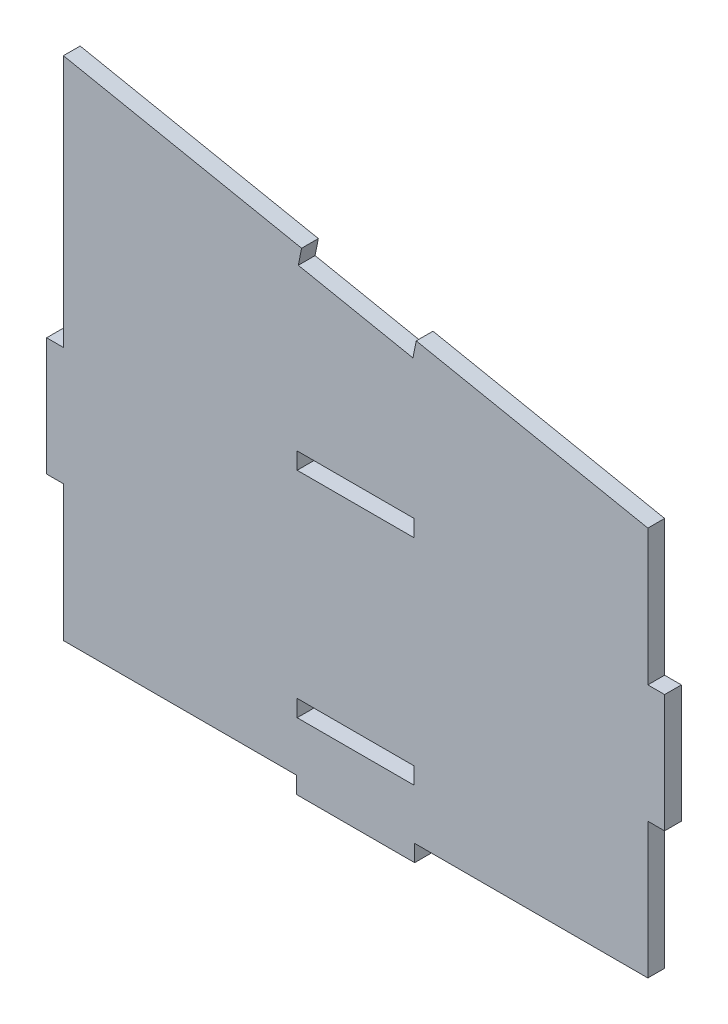
ISO-10303-21;
HEADER;
FILE_DESCRIPTION(('STEP AP214'),'2;1');
FILE_NAME('part.step','',(''),(''),'','','');
FILE_SCHEMA(('AUTOMOTIVE_DESIGN { 1 0 10303 214 1 1 1 1 }'));
ENDSEC;
DATA;
#1=APPLICATION_CONTEXT('core data for automotive mechanical design processes');
#2=APPLICATION_PROTOCOL_DEFINITION('international standard','automotive_design',2000,#1);
#3=PRODUCT_CONTEXT('',#1,'mechanical');
#4=PRODUCT('Part','Part','',(#3));
#5=PRODUCT_RELATED_PRODUCT_CATEGORY('part','',(#4));
#6=PRODUCT_DEFINITION_FORMATION('','',#4);
#7=PRODUCT_DEFINITION_CONTEXT('part definition',#1,'design');
#8=PRODUCT_DEFINITION('design','',#6,#7);
#9=PRODUCT_DEFINITION_SHAPE('','',#8);
#10=(LENGTH_UNIT() NAMED_UNIT(*) SI_UNIT(.MILLI.,.METRE.));
#11=(NAMED_UNIT(*) PLANE_ANGLE_UNIT() SI_UNIT($,.RADIAN.));
#12=(NAMED_UNIT(*) SI_UNIT($,.STERADIAN.) SOLID_ANGLE_UNIT());
#13=UNCERTAINTY_MEASURE_WITH_UNIT(LENGTH_MEASURE(1.E-05),#10,'distance_accuracy_value','');
#14=(GEOMETRIC_REPRESENTATION_CONTEXT(3) GLOBAL_UNCERTAINTY_ASSIGNED_CONTEXT((#13)) GLOBAL_UNIT_ASSIGNED_CONTEXT((#10,
#11,#12)) REPRESENTATION_CONTEXT('',''));
#15=CARTESIAN_POINT('',(0.,0.,0.));
#16=DIRECTION('',(0.,0.,1.));
#17=DIRECTION('',(1.,0.,0.));
#18=AXIS2_PLACEMENT_3D('',#15,#16,#17);
#19=CARTESIAN_POINT('',(0.,0.,4.3));
#20=DIRECTION('',(0.,0.,1.));
#21=DIRECTION('',(1.,0.,0.));
#22=AXIS2_PLACEMENT_3D('',#19,#20,#21);
#23=PLANE('',#22);
#24=DIRECTION('',(-0.98058067569092,0.196116135138184,0.));
#25=VECTOR('',#24,1.);
#26=CARTESIAN_POINT('',(61.1345892457303,117.773082150854,4.3));
#27=LINE('',#26,#25);
#28=CARTESIAN_POINT('',(61.1345892457303,117.773082150854,4.3));
#29=VERTEX_POINT('',#28);
#30=CARTESIAN_POINT('',(0.,130.,4.3));
#31=VERTEX_POINT('',#30);
#32=EDGE_CURVE('E288',#29,#31,#27,.T.);
#33=ORIENTED_EDGE('',*,*,#32,.T.);
#34=DIRECTION('',(0.,-1.,0.));
#35=VECTOR('',#34,1.);
#36=CARTESIAN_POINT('',(0.,130.,4.3));
#37=LINE('',#36,#35);
#38=CARTESIAN_POINT('',(0.,65.15,4.3));
#39=VERTEX_POINT('',#38);
#40=EDGE_CURVE('E291',#31,#39,#37,.T.);
#41=ORIENTED_EDGE('',*,*,#40,.T.);
#42=DIRECTION('',(-1.,0.,0.));
#43=VECTOR('',#42,1.);
#44=CARTESIAN_POINT('',(0.,65.15,4.3));
#45=LINE('',#44,#43);
#46=CARTESIAN_POINT('',(-4.3,65.15,4.3));
#47=VERTEX_POINT('',#46);
#48=EDGE_CURVE('E294',#39,#47,#45,.T.);
#49=ORIENTED_EDGE('',*,*,#48,.T.);
#50=DIRECTION('',(0.,-1.,0.));
#51=VECTOR('',#50,1.);
#52=CARTESIAN_POINT('',(-4.3,65.15,4.3));
#53=LINE('',#52,#51);
#54=CARTESIAN_POINT('',(-4.3,34.85,4.3));
#55=VERTEX_POINT('',#54);
#56=EDGE_CURVE('E296',#47,#55,#53,.T.);
#57=ORIENTED_EDGE('',*,*,#56,.T.);
#58=DIRECTION('',(1.,0.,0.));
#59=VECTOR('',#58,1.);
#60=CARTESIAN_POINT('',(0.,34.85,4.3));
#61=LINE('',#60,#59);
#62=CARTESIAN_POINT('',(0.,34.85,4.3));
#63=VERTEX_POINT('',#62);
#64=EDGE_CURVE('E298',#55,#63,#61,.T.);
#65=ORIENTED_EDGE('',*,*,#64,.T.);
#66=DIRECTION('',(0.,-1.,0.));
#67=VECTOR('',#66,1.);
#68=CARTESIAN_POINT('',(0.,34.85,4.3));
#69=LINE('',#68,#67);
#70=CARTESIAN_POINT('',(0.,0.,4.3));
#71=VERTEX_POINT('',#70);
#72=EDGE_CURVE('E300',#63,#71,#69,.T.);
#73=ORIENTED_EDGE('',*,*,#72,.T.);
#74=DIRECTION('',(1.,0.,0.));
#75=VECTOR('',#74,1.);
#76=CARTESIAN_POINT('',(0.,0.,4.3));
#77=LINE('',#76,#75);
#78=CARTESIAN_POINT('',(59.85,0.,4.3));
#79=VERTEX_POINT('',#78);
#80=EDGE_CURVE('E302',#71,#79,#77,.T.);
#81=ORIENTED_EDGE('',*,*,#80,.T.);
#82=DIRECTION('',(0.,-1.,0.));
#83=VECTOR('',#82,1.);
#84=CARTESIAN_POINT('',(59.85,0.,4.3));
#85=LINE('',#84,#83);
#86=CARTESIAN_POINT('',(59.85,-4.3,4.3));
#87=VERTEX_POINT('',#86);
#88=EDGE_CURVE('E304',#79,#87,#85,.T.);
#89=ORIENTED_EDGE('',*,*,#88,.T.);
#90=DIRECTION('',(1.,0.,0.));
#91=VECTOR('',#90,1.);
#92=CARTESIAN_POINT('',(90.15,-4.3,4.3));
#93=LINE('',#92,#91);
#94=CARTESIAN_POINT('',(90.15,-4.3,4.3));
#95=VERTEX_POINT('',#94);
#96=EDGE_CURVE('E306',#87,#95,#93,.T.);
#97=ORIENTED_EDGE('',*,*,#96,.T.);
#98=DIRECTION('',(0.,1.,0.));
#99=VECTOR('',#98,1.);
#100=CARTESIAN_POINT('',(90.15,0.,4.3));
#101=LINE('',#100,#99);
#102=CARTESIAN_POINT('',(90.15,0.,4.3));
#103=VERTEX_POINT('',#102);
#104=EDGE_CURVE('E308',#95,#103,#101,.T.);
#105=ORIENTED_EDGE('',*,*,#104,.T.);
#106=DIRECTION('',(1.,0.,0.));
#107=VECTOR('',#106,1.);
#108=CARTESIAN_POINT('',(90.15,0.,4.3));
#109=LINE('',#108,#107);
#110=CARTESIAN_POINT('',(150.,0.,4.3));
#111=VERTEX_POINT('',#110);
#112=EDGE_CURVE('E310',#103,#111,#109,.T.);
#113=ORIENTED_EDGE('',*,*,#112,.T.);
#114=DIRECTION('',(0.,1.,0.));
#115=VECTOR('',#114,1.);
#116=CARTESIAN_POINT('',(150.,0.,4.3));
#117=LINE('',#116,#115);
#118=CARTESIAN_POINT('',(150.,34.85,4.3));
#119=VERTEX_POINT('',#118);
#120=EDGE_CURVE('E312',#111,#119,#117,.T.);
#121=ORIENTED_EDGE('',*,*,#120,.T.);
#122=DIRECTION('',(1.,0.,0.));
#123=VECTOR('',#122,1.);
#124=CARTESIAN_POINT('',(150.,34.85,4.3));
#125=LINE('',#124,#123);
#126=CARTESIAN_POINT('',(154.3,34.85,4.3));
#127=VERTEX_POINT('',#126);
#128=EDGE_CURVE('E314',#119,#127,#125,.T.);
#129=ORIENTED_EDGE('',*,*,#128,.T.);
#130=DIRECTION('',(0.,1.,0.));
#131=VECTOR('',#130,1.);
#132=CARTESIAN_POINT('',(154.3,65.15,4.3));
#133=LINE('',#132,#131);
#134=CARTESIAN_POINT('',(154.3,65.15,4.3));
#135=VERTEX_POINT('',#134);
#136=EDGE_CURVE('E316',#127,#135,#133,.T.);
#137=ORIENTED_EDGE('',*,*,#136,.T.);
#138=DIRECTION('',(-1.,0.,0.));
#139=VECTOR('',#138,1.);
#140=CARTESIAN_POINT('',(150.,65.15,4.3));
#141=LINE('',#140,#139);
#142=CARTESIAN_POINT('',(150.,65.15,4.3));
#143=VERTEX_POINT('',#142);
#144=EDGE_CURVE('E318',#135,#143,#141,.T.);
#145=ORIENTED_EDGE('',*,*,#144,.T.);
#146=DIRECTION('',(0.,1.,0.));
#147=VECTOR('',#146,1.);
#148=CARTESIAN_POINT('',(150.,65.15,4.3));
#149=LINE('',#148,#147);
#150=CARTESIAN_POINT('',(150.,100.,4.3));
#151=VERTEX_POINT('',#150);
#152=EDGE_CURVE('E320',#143,#151,#149,.T.);
#153=ORIENTED_EDGE('',*,*,#152,.T.);
#154=DIRECTION('',(-0.98058067569092,0.196116135138184,0.));
#155=VECTOR('',#154,1.);
#156=CARTESIAN_POINT('',(150.,100.,4.3));
#157=LINE('',#156,#155);
#158=CARTESIAN_POINT('',(90.5520095164579,111.889598096708,4.3));
#159=VERTEX_POINT('',#158);
#160=EDGE_CURVE('E322',#151,#159,#157,.T.);
#161=ORIENTED_EDGE('',*,*,#160,.T.);
#162=DIRECTION('',(-0.196116135138183,-0.98058067569092,0.));
#163=VECTOR('',#162,1.);
#164=CARTESIAN_POINT('',(90.5520095164579,111.889598096708,4.3));
#165=LINE('',#164,#163);
#166=CARTESIAN_POINT('',(89.7087101353637,107.673101191237,4.3));
#167=VERTEX_POINT('',#166);
#168=EDGE_CURVE('E324',#159,#167,#165,.T.);
#169=ORIENTED_EDGE('',*,*,#168,.T.);
#170=DIRECTION('',(-0.98058067569092,0.196116135138184,0.));
#171=VECTOR('',#170,1.);
#172=CARTESIAN_POINT('',(89.7087101353637,107.673101191237,4.3));
#173=LINE('',#172,#171);
#174=CARTESIAN_POINT('',(60.2912898646361,113.556585245383,4.3));
#175=VERTEX_POINT('',#174);
#176=EDGE_CURVE('E326',#167,#175,#173,.T.);
#177=ORIENTED_EDGE('',*,*,#176,.T.);
#178=DIRECTION('',(0.196116135138188,0.980580675690919,0.));
#179=VECTOR('',#178,1.);
#180=CARTESIAN_POINT('',(61.1345892457303,117.773082150854,4.3));
#181=LINE('',#180,#179);
#182=EDGE_CURVE('E328',#175,#29,#181,.T.);
#183=ORIENTED_EDGE('',*,*,#182,.T.);
#184=EDGE_LOOP('',(#33,#41,#49,#57,#65,#73,#81,#89,#97,#105,#113,#121,#129,#137,#145,#153,#161,
#169,#177,#183));
#185=FACE_BOUND('',#184,.T.);
#186=DIRECTION('',(-1.,0.,0.));
#187=VECTOR('',#186,1.);
#188=CARTESIAN_POINT('',(60.,17.15,4.3));
#189=LINE('',#188,#187);
#190=CARTESIAN_POINT('',(90.,17.15,4.3));
#191=VERTEX_POINT('',#190);
#192=CARTESIAN_POINT('',(60.,17.15,4.3));
#193=VERTEX_POINT('',#192);
#194=EDGE_CURVE('E259',#191,#193,#189,.T.);
#195=ORIENTED_EDGE('',*,*,#194,.F.);
#196=DIRECTION('',(0.,1.,0.));
#197=VECTOR('',#196,1.);
#198=CARTESIAN_POINT('',(90.,17.15,4.3));
#199=LINE('',#198,#197);
#200=CARTESIAN_POINT('',(90.,12.85,4.3));
#201=VERTEX_POINT('',#200);
#202=EDGE_CURVE('E257',#201,#191,#199,.T.);
#203=ORIENTED_EDGE('',*,*,#202,.F.);
#204=DIRECTION('',(1.,0.,0.));
#205=VECTOR('',#204,1.);
#206=CARTESIAN_POINT('',(60.,12.85,4.3));
#207=LINE('',#206,#205);
#208=CARTESIAN_POINT('',(60.,12.85,4.3));
#209=VERTEX_POINT('',#208);
#210=EDGE_CURVE('E265',#209,#201,#207,.T.);
#211=ORIENTED_EDGE('',*,*,#210,.F.);
#212=DIRECTION('',(0.,-1.,0.));
#213=VECTOR('',#212,1.);
#214=CARTESIAN_POINT('',(60.,17.15,4.3));
#215=LINE('',#214,#213);
#216=EDGE_CURVE('E262',#193,#209,#215,.T.);
#217=ORIENTED_EDGE('',*,*,#216,.F.);
#218=EDGE_LOOP('',(#195,#203,#211,#217));
#219=FACE_BOUND('',#218,.T.);
#220=DIRECTION('',(-1.,0.,0.));
#221=VECTOR('',#220,1.);
#222=CARTESIAN_POINT('',(59.9999999999999,72.15,4.3));
#223=LINE('',#222,#221);
#224=CARTESIAN_POINT('',(89.9999999999999,72.15,4.3));
#225=VERTEX_POINT('',#224);
#226=CARTESIAN_POINT('',(59.9999999999999,72.15,4.3));
#227=VERTEX_POINT('',#226);
#228=EDGE_CURVE('E229',#225,#227,#223,.T.);
#229=ORIENTED_EDGE('',*,*,#228,.F.);
#230=DIRECTION('',(0.,1.,0.));
#231=VECTOR('',#230,1.);
#232=CARTESIAN_POINT('',(89.9999999999999,72.15,4.3));
#233=LINE('',#232,#231);
#234=CARTESIAN_POINT('',(89.9999999999999,67.85,4.3));
#235=VERTEX_POINT('',#234);
#236=EDGE_CURVE('E221',#235,#225,#233,.T.);
#237=ORIENTED_EDGE('',*,*,#236,.F.);
#238=DIRECTION('',(1.,0.,0.));
#239=VECTOR('',#238,1.);
#240=CARTESIAN_POINT('',(59.9999999999999,67.85,4.3));
#241=LINE('',#240,#239);
#242=CARTESIAN_POINT('',(59.9999999999999,67.85,4.3));
#243=VERTEX_POINT('',#242);
#244=EDGE_CURVE('E243',#243,#235,#241,.T.);
#245=ORIENTED_EDGE('',*,*,#244,.F.);
#246=DIRECTION('',(0.,-1.,0.));
#247=VECTOR('',#246,1.);
#248=CARTESIAN_POINT('',(59.9999999999999,72.15,4.3));
#249=LINE('',#248,#247);
#250=EDGE_CURVE('E241',#227,#243,#249,.T.);
#251=ORIENTED_EDGE('',*,*,#250,.F.);
#252=EDGE_LOOP('',(#229,#237,#245,#251));
#253=FACE_BOUND('',#252,.T.);
#254=ADVANCED_FACE('F36',(#185,#219,#253),#23,.T.);
#255=CARTESIAN_POINT('',(0.,0.,0.));
#256=DIRECTION('',(0.,0.,1.));
#257=DIRECTION('',(1.,0.,0.));
#258=AXIS2_PLACEMENT_3D('',#255,#256,#257);
#259=PLANE('',#258);
#260=DIRECTION('',(0.,1.,0.));
#261=VECTOR('',#260,1.);
#262=CARTESIAN_POINT('',(90.,17.15,0.));
#263=LINE('',#262,#261);
#264=CARTESIAN_POINT('',(90.,12.85,0.));
#265=VERTEX_POINT('',#264);
#266=CARTESIAN_POINT('',(90.,17.15,0.));
#267=VERTEX_POINT('',#266);
#268=EDGE_CURVE('E237',#265,#267,#263,.T.);
#269=ORIENTED_EDGE('',*,*,#268,.T.);
#270=DIRECTION('',(-1.,0.,0.));
#271=VECTOR('',#270,1.);
#272=CARTESIAN_POINT('',(60.,17.15,0.));
#273=LINE('',#272,#271);
#274=CARTESIAN_POINT('',(60.,17.15,0.));
#275=VERTEX_POINT('',#274);
#276=EDGE_CURVE('E270',#267,#275,#273,.T.);
#277=ORIENTED_EDGE('',*,*,#276,.T.);
#278=DIRECTION('',(0.,-1.,0.));
#279=VECTOR('',#278,1.);
#280=CARTESIAN_POINT('',(60.,17.15,0.));
#281=LINE('',#280,#279);
#282=CARTESIAN_POINT('',(60.,12.85,0.));
#283=VERTEX_POINT('',#282);
#284=EDGE_CURVE('E273',#275,#283,#281,.T.);
#285=ORIENTED_EDGE('',*,*,#284,.T.);
#286=DIRECTION('',(1.,0.,0.));
#287=VECTOR('',#286,1.);
#288=CARTESIAN_POINT('',(60.,12.85,0.));
#289=LINE('',#288,#287);
#290=EDGE_CURVE('E260',#283,#265,#289,.T.);
#291=ORIENTED_EDGE('',*,*,#290,.T.);
#292=EDGE_LOOP('',(#269,#277,#285,#291));
#293=FACE_BOUND('',#292,.T.);
#294=DIRECTION('',(-0.98058067569092,0.196116135138184,0.));
#295=VECTOR('',#294,1.);
#296=CARTESIAN_POINT('',(61.1345892457303,117.773082150854,0.));
#297=LINE('',#296,#295);
#298=CARTESIAN_POINT('',(61.1345892457303,117.773082150854,0.));
#299=VERTEX_POINT('',#298);
#300=CARTESIAN_POINT('',(0.,130.,0.));
#301=VERTEX_POINT('',#300);
#302=EDGE_CURVE('E287',#299,#301,#297,.T.);
#303=ORIENTED_EDGE('',*,*,#302,.F.);
#304=DIRECTION('',(0.196116135138188,0.980580675690919,0.));
#305=VECTOR('',#304,1.);
#306=CARTESIAN_POINT('',(61.1345892457303,117.773082150854,0.));
#307=LINE('',#306,#305);
#308=CARTESIAN_POINT('',(60.2912898646361,113.556585245383,0.));
#309=VERTEX_POINT('',#308);
#310=EDGE_CURVE('E292',#309,#299,#307,.T.);
#311=ORIENTED_EDGE('',*,*,#310,.F.);
#312=DIRECTION('',(-0.98058067569092,0.196116135138184,0.));
#313=VECTOR('',#312,1.);
#314=CARTESIAN_POINT('',(89.7087101353637,107.673101191237,0.));
#315=LINE('',#314,#313);
#316=CARTESIAN_POINT('',(89.7087101353637,107.673101191237,0.));
#317=VERTEX_POINT('',#316);
#318=EDGE_CURVE('E367',#317,#309,#315,.T.);
#319=ORIENTED_EDGE('',*,*,#318,.F.);
#320=DIRECTION('',(-0.196116135138183,-0.98058067569092,0.));
#321=VECTOR('',#320,1.);
#322=CARTESIAN_POINT('',(90.5520095164579,111.889598096708,0.));
#323=LINE('',#322,#321);
#324=CARTESIAN_POINT('',(90.5520095164579,111.889598096708,0.));
#325=VERTEX_POINT('',#324);
#326=EDGE_CURVE('E365',#325,#317,#323,.T.);
#327=ORIENTED_EDGE('',*,*,#326,.F.);
#328=DIRECTION('',(-0.98058067569092,0.196116135138184,0.));
#329=VECTOR('',#328,1.);
#330=CARTESIAN_POINT('',(150.,100.,0.));
#331=LINE('',#330,#329);
#332=CARTESIAN_POINT('',(150.,100.,0.));
#333=VERTEX_POINT('',#332);
#334=EDGE_CURVE('E363',#333,#325,#331,.T.);
#335=ORIENTED_EDGE('',*,*,#334,.F.);
#336=DIRECTION('',(0.,1.,0.));
#337=VECTOR('',#336,1.);
#338=CARTESIAN_POINT('',(150.,65.15,0.));
#339=LINE('',#338,#337);
#340=CARTESIAN_POINT('',(150.,65.15,0.));
#341=VERTEX_POINT('',#340);
#342=EDGE_CURVE('E361',#341,#333,#339,.T.);
#343=ORIENTED_EDGE('',*,*,#342,.F.);
#344=DIRECTION('',(-1.,0.,0.));
#345=VECTOR('',#344,1.);
#346=CARTESIAN_POINT('',(150.,65.15,0.));
#347=LINE('',#346,#345);
#348=CARTESIAN_POINT('',(154.3,65.15,0.));
#349=VERTEX_POINT('',#348);
#350=EDGE_CURVE('E359',#349,#341,#347,.T.);
#351=ORIENTED_EDGE('',*,*,#350,.F.);
#352=DIRECTION('',(0.,1.,0.));
#353=VECTOR('',#352,1.);
#354=CARTESIAN_POINT('',(154.3,65.15,0.));
#355=LINE('',#354,#353);
#356=CARTESIAN_POINT('',(154.3,34.85,0.));
#357=VERTEX_POINT('',#356);
#358=EDGE_CURVE('E357',#357,#349,#355,.T.);
#359=ORIENTED_EDGE('',*,*,#358,.F.);
#360=DIRECTION('',(1.,0.,0.));
#361=VECTOR('',#360,1.);
#362=CARTESIAN_POINT('',(150.,34.85,0.));
#363=LINE('',#362,#361);
#364=CARTESIAN_POINT('',(150.,34.85,0.));
#365=VERTEX_POINT('',#364);
#366=EDGE_CURVE('E355',#365,#357,#363,.T.);
#367=ORIENTED_EDGE('',*,*,#366,.F.);
#368=DIRECTION('',(0.,1.,0.));
#369=VECTOR('',#368,1.);
#370=CARTESIAN_POINT('',(150.,0.,0.));
#371=LINE('',#370,#369);
#372=CARTESIAN_POINT('',(150.,0.,0.));
#373=VERTEX_POINT('',#372);
#374=EDGE_CURVE('E353',#373,#365,#371,.T.);
#375=ORIENTED_EDGE('',*,*,#374,.F.);
#376=DIRECTION('',(1.,0.,0.));
#377=VECTOR('',#376,1.);
#378=CARTESIAN_POINT('',(90.15,0.,0.));
#379=LINE('',#378,#377);
#380=CARTESIAN_POINT('',(90.15,0.,0.));
#381=VERTEX_POINT('',#380);
#382=EDGE_CURVE('E351',#381,#373,#379,.T.);
#383=ORIENTED_EDGE('',*,*,#382,.F.);
#384=DIRECTION('',(0.,1.,0.));
#385=VECTOR('',#384,1.);
#386=CARTESIAN_POINT('',(90.15,0.,0.));
#387=LINE('',#386,#385);
#388=CARTESIAN_POINT('',(90.15,-4.3,0.));
#389=VERTEX_POINT('',#388);
#390=EDGE_CURVE('E349',#389,#381,#387,.T.);
#391=ORIENTED_EDGE('',*,*,#390,.F.);
#392=DIRECTION('',(1.,0.,0.));
#393=VECTOR('',#392,1.);
#394=CARTESIAN_POINT('',(90.15,-4.3,0.));
#395=LINE('',#394,#393);
#396=CARTESIAN_POINT('',(59.85,-4.3,0.));
#397=VERTEX_POINT('',#396);
#398=EDGE_CURVE('E347',#397,#389,#395,.T.);
#399=ORIENTED_EDGE('',*,*,#398,.F.);
#400=DIRECTION('',(0.,-1.,0.));
#401=VECTOR('',#400,1.);
#402=CARTESIAN_POINT('',(59.85,0.,0.));
#403=LINE('',#402,#401);
#404=CARTESIAN_POINT('',(59.85,0.,0.));
#405=VERTEX_POINT('',#404);
#406=EDGE_CURVE('E345',#405,#397,#403,.T.);
#407=ORIENTED_EDGE('',*,*,#406,.F.);
#408=DIRECTION('',(1.,0.,0.));
#409=VECTOR('',#408,1.);
#410=CARTESIAN_POINT('',(0.,0.,0.));
#411=LINE('',#410,#409);
#412=CARTESIAN_POINT('',(0.,0.,0.));
#413=VERTEX_POINT('',#412);
#414=EDGE_CURVE('E343',#413,#405,#411,.T.);
#415=ORIENTED_EDGE('',*,*,#414,.F.);
#416=DIRECTION('',(0.,-1.,0.));
#417=VECTOR('',#416,1.);
#418=CARTESIAN_POINT('',(0.,34.85,0.));
#419=LINE('',#418,#417);
#420=CARTESIAN_POINT('',(0.,34.85,0.));
#421=VERTEX_POINT('',#420);
#422=EDGE_CURVE('E341',#421,#413,#419,.T.);
#423=ORIENTED_EDGE('',*,*,#422,.F.);
#424=DIRECTION('',(1.,0.,0.));
#425=VECTOR('',#424,1.);
#426=CARTESIAN_POINT('',(0.,34.85,0.));
#427=LINE('',#426,#425);
#428=CARTESIAN_POINT('',(-4.3,34.85,0.));
#429=VERTEX_POINT('',#428);
#430=EDGE_CURVE('E339',#429,#421,#427,.T.);
#431=ORIENTED_EDGE('',*,*,#430,.F.);
#432=DIRECTION('',(0.,-1.,0.));
#433=VECTOR('',#432,1.);
#434=CARTESIAN_POINT('',(-4.3,65.15,0.));
#435=LINE('',#434,#433);
#436=CARTESIAN_POINT('',(-4.3,65.15,0.));
#437=VERTEX_POINT('',#436);
#438=EDGE_CURVE('E337',#437,#429,#435,.T.);
#439=ORIENTED_EDGE('',*,*,#438,.F.);
#440=DIRECTION('',(-1.,0.,0.));
#441=VECTOR('',#440,1.);
#442=CARTESIAN_POINT('',(0.,65.15,0.));
#443=LINE('',#442,#441);
#444=CARTESIAN_POINT('',(0.,65.15,0.));
#445=VERTEX_POINT('',#444);
#446=EDGE_CURVE('E335',#445,#437,#443,.T.);
#447=ORIENTED_EDGE('',*,*,#446,.F.);
#448=DIRECTION('',(0.,-1.,0.));
#449=VECTOR('',#448,1.);
#450=CARTESIAN_POINT('',(0.,130.,0.));
#451=LINE('',#450,#449);
#452=EDGE_CURVE('E333',#301,#445,#451,.T.);
#453=ORIENTED_EDGE('',*,*,#452,.F.);
#454=EDGE_LOOP('',(#303,#311,#319,#327,#335,#343,#351,#359,#367,#375,#383,#391,#399,#407,#415,
#423,#431,#439,#447,#453));
#455=FACE_BOUND('',#454,.T.);
#456=DIRECTION('',(0.,1.,0.));
#457=VECTOR('',#456,1.);
#458=CARTESIAN_POINT('',(89.9999999999999,72.15,0.));
#459=LINE('',#458,#457);
#460=CARTESIAN_POINT('',(89.9999999999999,67.85,0.));
#461=VERTEX_POINT('',#460);
#462=CARTESIAN_POINT('',(89.9999999999999,72.15,0.));
#463=VERTEX_POINT('',#462);
#464=EDGE_CURVE('E59',#461,#463,#459,.T.);
#465=ORIENTED_EDGE('',*,*,#464,.T.);
#466=DIRECTION('',(-1.,0.,0.));
#467=VECTOR('',#466,1.);
#468=CARTESIAN_POINT('',(59.9999999999999,72.15,0.));
#469=LINE('',#468,#467);
#470=CARTESIAN_POINT('',(59.9999999999999,72.15,0.));
#471=VERTEX_POINT('',#470);
#472=EDGE_CURVE('E236',#463,#471,#469,.T.);
#473=ORIENTED_EDGE('',*,*,#472,.T.);
#474=DIRECTION('',(0.,-1.,0.));
#475=VECTOR('',#474,1.);
#476=CARTESIAN_POINT('',(59.9999999999999,72.15,0.));
#477=LINE('',#476,#475);
#478=CARTESIAN_POINT('',(59.9999999999999,67.85,0.));
#479=VERTEX_POINT('',#478);
#480=EDGE_CURVE('E249',#471,#479,#477,.T.);
#481=ORIENTED_EDGE('',*,*,#480,.T.);
#482=DIRECTION('',(1.,0.,0.));
#483=VECTOR('',#482,1.);
#484=CARTESIAN_POINT('',(59.9999999999999,67.85,0.));
#485=LINE('',#484,#483);
#486=EDGE_CURVE('E230',#479,#461,#485,.T.);
#487=ORIENTED_EDGE('',*,*,#486,.T.);
#488=EDGE_LOOP('',(#465,#473,#481,#487));
#489=FACE_BOUND('',#488,.T.);
#490=ADVANCED_FACE('F433',(#293,#455,#489),#259,.F.);
#491=CARTESIAN_POINT('',(61.1345892457303,117.773082150854,4.3));
#492=DIRECTION('',(-0.196116135138184,-0.98058067569092,0.));
#493=DIRECTION('',(0.98058067569092,-0.196116135138184,0.));
#494=AXIS2_PLACEMENT_3D('',#491,#492,#493);
#495=PLANE('',#494);
#496=ORIENTED_EDGE('',*,*,#302,.T.);
#497=DIRECTION('',(0.,0.,-1.));
#498=VECTOR('',#497,1.);
#499=CARTESIAN_POINT('',(0.,130.,4.3));
#500=LINE('',#499,#498);
#501=EDGE_CURVE('E11',#31,#301,#500,.T.);
#502=ORIENTED_EDGE('',*,*,#501,.F.);
#503=ORIENTED_EDGE('',*,*,#32,.F.);
#504=DIRECTION('',(0.,0.,-1.));
#505=VECTOR('',#504,1.);
#506=CARTESIAN_POINT('',(61.1345892457303,117.773082150854,4.3));
#507=LINE('',#506,#505);
#508=EDGE_CURVE('E330',#29,#299,#507,.T.);
#509=ORIENTED_EDGE('',*,*,#508,.T.);
#510=EDGE_LOOP('',(#496,#502,#503,#509));
#511=FACE_BOUND('',#510,.T.);
#512=ADVANCED_FACE('F38',(#511),#495,.F.);
#513=CARTESIAN_POINT('',(0.,130.,4.3));
#514=DIRECTION('',(1.,0.,0.));
#515=DIRECTION('',(0.,1.,0.));
#516=AXIS2_PLACEMENT_3D('',#513,#514,#515);
#517=PLANE('',#516);
#518=ORIENTED_EDGE('',*,*,#452,.T.);
#519=DIRECTION('',(0.,0.,-1.));
#520=VECTOR('',#519,1.);
#521=CARTESIAN_POINT('',(0.,65.15,4.3));
#522=LINE('',#521,#520);
#523=EDGE_CURVE('E44',#39,#445,#522,.T.);
#524=ORIENTED_EDGE('',*,*,#523,.F.);
#525=ORIENTED_EDGE('',*,*,#40,.F.);
#526=ORIENTED_EDGE('',*,*,#501,.T.);
#527=EDGE_LOOP('',(#518,#524,#525,#526));
#528=FACE_BOUND('',#527,.T.);
#529=ADVANCED_FACE('F451',(#528),#517,.F.);
#530=CARTESIAN_POINT('',(0.,65.15,4.3));
#531=DIRECTION('',(0.,-1.,0.));
#532=DIRECTION('',(0.,0.,-1.));
#533=AXIS2_PLACEMENT_3D('',#530,#531,#532);
#534=PLANE('',#533);
#535=ORIENTED_EDGE('',*,*,#446,.T.);
#536=DIRECTION('',(0.,0.,-1.));
#537=VECTOR('',#536,1.);
#538=CARTESIAN_POINT('',(-4.3,65.15,4.3));
#539=LINE('',#538,#537);
#540=EDGE_CURVE('E420',#47,#437,#539,.T.);
#541=ORIENTED_EDGE('',*,*,#540,.F.);
#542=ORIENTED_EDGE('',*,*,#48,.F.);
#543=ORIENTED_EDGE('',*,*,#523,.T.);
#544=EDGE_LOOP('',(#535,#541,#542,#543));
#545=FACE_BOUND('',#544,.T.);
#546=ADVANCED_FACE('F427',(#545),#534,.F.);
#547=CARTESIAN_POINT('',(-4.3,65.15,4.3));
#548=DIRECTION('',(1.,0.,0.));
#549=DIRECTION('',(0.,0.,-1.));
#550=AXIS2_PLACEMENT_3D('',#547,#548,#549);
#551=PLANE('',#550);
#552=ORIENTED_EDGE('',*,*,#438,.T.);
#553=DIRECTION('',(0.,0.,-1.));
#554=VECTOR('',#553,1.);
#555=CARTESIAN_POINT('',(-4.3,34.85,4.3));
#556=LINE('',#555,#554);
#557=EDGE_CURVE('E417',#55,#429,#556,.T.);
#558=ORIENTED_EDGE('',*,*,#557,.F.);
#559=ORIENTED_EDGE('',*,*,#56,.F.);
#560=ORIENTED_EDGE('',*,*,#540,.T.);
#561=EDGE_LOOP('',(#552,#558,#559,#560));
#562=FACE_BOUND('',#561,.T.);
#563=ADVANCED_FACE('F439',(#562),#551,.F.);
#564=CARTESIAN_POINT('',(0.,34.85,4.3));
#565=DIRECTION('',(0.,1.,0.));
#566=DIRECTION('',(0.,0.,1.));
#567=AXIS2_PLACEMENT_3D('',#564,#565,#566);
#568=PLANE('',#567);
#569=ORIENTED_EDGE('',*,*,#430,.T.);
#570=DIRECTION('',(0.,0.,-1.));
#571=VECTOR('',#570,1.);
#572=CARTESIAN_POINT('',(0.,34.85,4.3));
#573=LINE('',#572,#571);
#574=EDGE_CURVE('E414',#63,#421,#573,.T.);
#575=ORIENTED_EDGE('',*,*,#574,.F.);
#576=ORIENTED_EDGE('',*,*,#64,.F.);
#577=ORIENTED_EDGE('',*,*,#557,.T.);
#578=EDGE_LOOP('',(#569,#575,#576,#577));
#579=FACE_BOUND('',#578,.T.);
#580=ADVANCED_FACE('F443',(#579),#568,.F.);
#581=CARTESIAN_POINT('',(0.,34.85,4.3));
#582=DIRECTION('',(1.,0.,0.));
#583=DIRECTION('',(0.,1.,0.));
#584=AXIS2_PLACEMENT_3D('',#581,#582,#583);
#585=PLANE('',#584);
#586=ORIENTED_EDGE('',*,*,#422,.T.);
#587=DIRECTION('',(0.,0.,-1.));
#588=VECTOR('',#587,1.);
#589=CARTESIAN_POINT('',(0.,0.,4.3));
#590=LINE('',#589,#588);
#591=EDGE_CURVE('E411',#71,#413,#590,.T.);
#592=ORIENTED_EDGE('',*,*,#591,.F.);
#593=ORIENTED_EDGE('',*,*,#72,.F.);
#594=ORIENTED_EDGE('',*,*,#574,.T.);
#595=EDGE_LOOP('',(#586,#592,#593,#594));
#596=FACE_BOUND('',#595,.T.);
#597=ADVANCED_FACE('F524',(#596),#585,.F.);
#598=CARTESIAN_POINT('',(0.,0.,4.3));
#599=DIRECTION('',(0.,1.,0.));
#600=DIRECTION('',(0.,0.,1.));
#601=AXIS2_PLACEMENT_3D('',#598,#599,#600);
#602=PLANE('',#601);
#603=ORIENTED_EDGE('',*,*,#414,.T.);
#604=DIRECTION('',(0.,0.,-1.));
#605=VECTOR('',#604,1.);
#606=CARTESIAN_POINT('',(59.85,0.,4.3));
#607=LINE('',#606,#605);
#608=EDGE_CURVE('E408',#79,#405,#607,.T.);
#609=ORIENTED_EDGE('',*,*,#608,.F.);
#610=ORIENTED_EDGE('',*,*,#80,.F.);
#611=ORIENTED_EDGE('',*,*,#591,.T.);
#612=EDGE_LOOP('',(#603,#609,#610,#611));
#613=FACE_BOUND('',#612,.T.);
#614=ADVANCED_FACE('F522',(#613),#602,.F.);
#615=CARTESIAN_POINT('',(59.85,0.,4.3));
#616=DIRECTION('',(1.,0.,0.));
#617=DIRECTION('',(0.,0.,-1.));
#618=AXIS2_PLACEMENT_3D('',#615,#616,#617);
#619=PLANE('',#618);
#620=ORIENTED_EDGE('',*,*,#406,.T.);
#621=DIRECTION('',(0.,0.,-1.));
#622=VECTOR('',#621,1.);
#623=CARTESIAN_POINT('',(59.85,-4.3,4.3));
#624=LINE('',#623,#622);
#625=EDGE_CURVE('E405',#87,#397,#624,.T.);
#626=ORIENTED_EDGE('',*,*,#625,.F.);
#627=ORIENTED_EDGE('',*,*,#88,.F.);
#628=ORIENTED_EDGE('',*,*,#608,.T.);
#629=EDGE_LOOP('',(#620,#626,#627,#628));
#630=FACE_BOUND('',#629,.T.);
#631=ADVANCED_FACE('F517',(#630),#619,.F.);
#632=CARTESIAN_POINT('',(90.15,-4.3,4.3));
#633=DIRECTION('',(0.,1.,0.));
#634=DIRECTION('',(0.,0.,1.));
#635=AXIS2_PLACEMENT_3D('',#632,#633,#634);
#636=PLANE('',#635);
#637=ORIENTED_EDGE('',*,*,#398,.T.);
#638=DIRECTION('',(0.,0.,-1.));
#639=VECTOR('',#638,1.);
#640=CARTESIAN_POINT('',(90.15,-4.3,4.3));
#641=LINE('',#640,#639);
#642=EDGE_CURVE('E402',#95,#389,#641,.T.);
#643=ORIENTED_EDGE('',*,*,#642,.F.);
#644=ORIENTED_EDGE('',*,*,#96,.F.);
#645=ORIENTED_EDGE('',*,*,#625,.T.);
#646=EDGE_LOOP('',(#637,#643,#644,#645));
#647=FACE_BOUND('',#646,.T.);
#648=ADVANCED_FACE('F512',(#647),#636,.F.);
#649=CARTESIAN_POINT('',(90.15,0.,4.3));
#650=DIRECTION('',(-1.,0.,0.));
#651=DIRECTION('',(0.,-1.,0.));
#652=AXIS2_PLACEMENT_3D('',#649,#650,#651);
#653=PLANE('',#652);
#654=ORIENTED_EDGE('',*,*,#390,.T.);
#655=DIRECTION('',(0.,0.,-1.));
#656=VECTOR('',#655,1.);
#657=CARTESIAN_POINT('',(90.15,0.,4.3));
#658=LINE('',#657,#656);
#659=EDGE_CURVE('E399',#103,#381,#658,.T.);
#660=ORIENTED_EDGE('',*,*,#659,.F.);
#661=ORIENTED_EDGE('',*,*,#104,.F.);
#662=ORIENTED_EDGE('',*,*,#642,.T.);
#663=EDGE_LOOP('',(#654,#660,#661,#662));
#664=FACE_BOUND('',#663,.T.);
#665=ADVANCED_FACE('F508',(#664),#653,.F.);
#666=CARTESIAN_POINT('',(90.15,0.,4.3));
#667=DIRECTION('',(0.,1.,0.));
#668=DIRECTION('',(-1.,0.,0.));
#669=AXIS2_PLACEMENT_3D('',#666,#667,#668);
#670=PLANE('',#669);
#671=ORIENTED_EDGE('',*,*,#382,.T.);
#672=DIRECTION('',(0.,0.,-1.));
#673=VECTOR('',#672,1.);
#674=CARTESIAN_POINT('',(150.,0.,4.3));
#675=LINE('',#674,#673);
#676=EDGE_CURVE('E396',#111,#373,#675,.T.);
#677=ORIENTED_EDGE('',*,*,#676,.F.);
#678=ORIENTED_EDGE('',*,*,#112,.F.);
#679=ORIENTED_EDGE('',*,*,#659,.T.);
#680=EDGE_LOOP('',(#671,#677,#678,#679));
#681=FACE_BOUND('',#680,.T.);
#682=ADVANCED_FACE('F503',(#681),#670,.F.);
#683=CARTESIAN_POINT('',(150.,0.,4.3));
#684=DIRECTION('',(-1.,0.,0.));
#685=DIRECTION('',(0.,0.,1.));
#686=AXIS2_PLACEMENT_3D('',#683,#684,#685);
#687=PLANE('',#686);
#688=ORIENTED_EDGE('',*,*,#374,.T.);
#689=DIRECTION('',(0.,0.,-1.));
#690=VECTOR('',#689,1.);
#691=CARTESIAN_POINT('',(150.,34.85,4.3));
#692=LINE('',#691,#690);
#693=EDGE_CURVE('E393',#119,#365,#692,.T.);
#694=ORIENTED_EDGE('',*,*,#693,.F.);
#695=ORIENTED_EDGE('',*,*,#120,.F.);
#696=ORIENTED_EDGE('',*,*,#676,.T.);
#697=EDGE_LOOP('',(#688,#694,#695,#696));
#698=FACE_BOUND('',#697,.T.);
#699=ADVANCED_FACE('F497',(#698),#687,.F.);
#700=CARTESIAN_POINT('',(150.,34.85,4.3));
#701=DIRECTION('',(0.,1.,0.));
#702=DIRECTION('',(0.,0.,1.));
#703=AXIS2_PLACEMENT_3D('',#700,#701,#702);
#704=PLANE('',#703);
#705=ORIENTED_EDGE('',*,*,#366,.T.);
#706=DIRECTION('',(0.,0.,-1.));
#707=VECTOR('',#706,1.);
#708=CARTESIAN_POINT('',(154.3,34.85,4.3));
#709=LINE('',#708,#707);
#710=EDGE_CURVE('E390',#127,#357,#709,.T.);
#711=ORIENTED_EDGE('',*,*,#710,.F.);
#712=ORIENTED_EDGE('',*,*,#128,.F.);
#713=ORIENTED_EDGE('',*,*,#693,.T.);
#714=EDGE_LOOP('',(#705,#711,#712,#713));
#715=FACE_BOUND('',#714,.T.);
#716=ADVANCED_FACE('F493',(#715),#704,.F.);
#717=CARTESIAN_POINT('',(154.3,65.15,4.3));
#718=DIRECTION('',(-1.,0.,0.));
#719=DIRECTION('',(0.,0.,1.));
#720=AXIS2_PLACEMENT_3D('',#717,#718,#719);
#721=PLANE('',#720);
#722=ORIENTED_EDGE('',*,*,#358,.T.);
#723=DIRECTION('',(0.,0.,-1.));
#724=VECTOR('',#723,1.);
#725=CARTESIAN_POINT('',(154.3,65.15,4.3));
#726=LINE('',#725,#724);
#727=EDGE_CURVE('E387',#135,#349,#726,.T.);
#728=ORIENTED_EDGE('',*,*,#727,.F.);
#729=ORIENTED_EDGE('',*,*,#136,.F.);
#730=ORIENTED_EDGE('',*,*,#710,.T.);
#731=EDGE_LOOP('',(#722,#728,#729,#730));
#732=FACE_BOUND('',#731,.T.);
#733=ADVANCED_FACE('F488',(#732),#721,.F.);
#734=CARTESIAN_POINT('',(150.,65.15,4.3));
#735=DIRECTION('',(0.,-1.,0.));
#736=DIRECTION('',(0.,0.,-1.));
#737=AXIS2_PLACEMENT_3D('',#734,#735,#736);
#738=PLANE('',#737);
#739=ORIENTED_EDGE('',*,*,#350,.T.);
#740=DIRECTION('',(0.,0.,-1.));
#741=VECTOR('',#740,1.);
#742=CARTESIAN_POINT('',(150.,65.15,4.3));
#743=LINE('',#742,#741);
#744=EDGE_CURVE('E384',#143,#341,#743,.T.);
#745=ORIENTED_EDGE('',*,*,#744,.F.);
#746=ORIENTED_EDGE('',*,*,#144,.F.);
#747=ORIENTED_EDGE('',*,*,#727,.T.);
#748=EDGE_LOOP('',(#739,#745,#746,#747));
#749=FACE_BOUND('',#748,.T.);
#750=ADVANCED_FACE('F482',(#749),#738,.F.);
#751=CARTESIAN_POINT('',(150.,65.15,4.3));
#752=DIRECTION('',(-1.,0.,0.));
#753=DIRECTION('',(0.,0.,1.));
#754=AXIS2_PLACEMENT_3D('',#751,#752,#753);
#755=PLANE('',#754);
#756=ORIENTED_EDGE('',*,*,#342,.T.);
#757=DIRECTION('',(0.,0.,-1.));
#758=VECTOR('',#757,1.);
#759=CARTESIAN_POINT('',(150.,100.,4.3));
#760=LINE('',#759,#758);
#761=EDGE_CURVE('E381',#151,#333,#760,.T.);
#762=ORIENTED_EDGE('',*,*,#761,.F.);
#763=ORIENTED_EDGE('',*,*,#152,.F.);
#764=ORIENTED_EDGE('',*,*,#744,.T.);
#765=EDGE_LOOP('',(#756,#762,#763,#764));
#766=FACE_BOUND('',#765,.T.);
#767=ADVANCED_FACE('F478',(#766),#755,.F.);
#768=CARTESIAN_POINT('',(150.,100.,4.3));
#769=DIRECTION('',(-0.196116135138184,-0.98058067569092,0.));
#770=DIRECTION('',(0.98058067569092,-0.196116135138184,0.));
#771=AXIS2_PLACEMENT_3D('',#768,#769,#770);
#772=PLANE('',#771);
#773=ORIENTED_EDGE('',*,*,#334,.T.);
#774=DIRECTION('',(0.,0.,-1.));
#775=VECTOR('',#774,1.);
#776=CARTESIAN_POINT('',(90.5520095164579,111.889598096708,4.3));
#777=LINE('',#776,#775);
#778=EDGE_CURVE('E378',#159,#325,#777,.T.);
#779=ORIENTED_EDGE('',*,*,#778,.F.);
#780=ORIENTED_EDGE('',*,*,#160,.F.);
#781=ORIENTED_EDGE('',*,*,#761,.T.);
#782=EDGE_LOOP('',(#773,#779,#780,#781));
#783=FACE_BOUND('',#782,.T.);
#784=ADVANCED_FACE('F473',(#783),#772,.F.);
#785=CARTESIAN_POINT('',(90.5520095164579,111.889598096708,4.3));
#786=DIRECTION('',(0.98058067569092,-0.196116135138183,0.));
#787=DIRECTION('',(0.196116135138183,0.98058067569092,0.));
#788=AXIS2_PLACEMENT_3D('',#785,#786,#787);
#789=PLANE('',#788);
#790=ORIENTED_EDGE('',*,*,#326,.T.);
#791=DIRECTION('',(0.,0.,-1.));
#792=VECTOR('',#791,1.);
#793=CARTESIAN_POINT('',(89.7087101353637,107.673101191237,4.3));
#794=LINE('',#793,#792);
#795=EDGE_CURVE('E375',#167,#317,#794,.T.);
#796=ORIENTED_EDGE('',*,*,#795,.F.);
#797=ORIENTED_EDGE('',*,*,#168,.F.);
#798=ORIENTED_EDGE('',*,*,#778,.T.);
#799=EDGE_LOOP('',(#790,#796,#797,#798));
#800=FACE_BOUND('',#799,.T.);
#801=ADVANCED_FACE('F467',(#800),#789,.F.);
#802=CARTESIAN_POINT('',(89.7087101353637,107.673101191237,4.3));
#803=DIRECTION('',(-0.196116135138184,-0.98058067569092,0.));
#804=DIRECTION('',(0.98058067569092,-0.196116135138184,0.));
#805=AXIS2_PLACEMENT_3D('',#802,#803,#804);
#806=PLANE('',#805);
#807=ORIENTED_EDGE('',*,*,#318,.T.);
#808=DIRECTION('',(0.,0.,-1.));
#809=VECTOR('',#808,1.);
#810=CARTESIAN_POINT('',(60.2912898646361,113.556585245383,4.3));
#811=LINE('',#810,#809);
#812=EDGE_CURVE('E372',#175,#309,#811,.T.);
#813=ORIENTED_EDGE('',*,*,#812,.F.);
#814=ORIENTED_EDGE('',*,*,#176,.F.);
#815=ORIENTED_EDGE('',*,*,#795,.T.);
#816=EDGE_LOOP('',(#807,#813,#814,#815));
#817=FACE_BOUND('',#816,.T.);
#818=ADVANCED_FACE('F463',(#817),#806,.F.);
#819=CARTESIAN_POINT('',(61.1345892457303,117.773082150854,4.3));
#820=DIRECTION('',(-0.980580675690919,0.196116135138188,0.));
#821=DIRECTION('',(-0.196116135138188,-0.980580675690919,0.));
#822=AXIS2_PLACEMENT_3D('',#819,#820,#821);
#823=PLANE('',#822);
#824=ORIENTED_EDGE('',*,*,#310,.T.);
#825=ORIENTED_EDGE('',*,*,#508,.F.);
#826=ORIENTED_EDGE('',*,*,#182,.F.);
#827=ORIENTED_EDGE('',*,*,#812,.T.);
#828=EDGE_LOOP('',(#824,#825,#826,#827));
#829=FACE_BOUND('',#828,.T.);
#830=ADVANCED_FACE('F458',(#829),#823,.F.);
#831=CARTESIAN_POINT('',(90.,17.15,4.3));
#832=DIRECTION('',(-1.,0.,0.));
#833=DIRECTION('',(0.,0.,1.));
#834=AXIS2_PLACEMENT_3D('',#831,#832,#833);
#835=PLANE('',#834);
#836=ORIENTED_EDGE('',*,*,#268,.F.);
#837=DIRECTION('',(0.,0.,-1.));
#838=VECTOR('',#837,1.);
#839=CARTESIAN_POINT('',(90.,12.85,4.3));
#840=LINE('',#839,#838);
#841=EDGE_CURVE('E267',#201,#265,#840,.T.);
#842=ORIENTED_EDGE('',*,*,#841,.F.);
#843=ORIENTED_EDGE('',*,*,#202,.T.);
#844=DIRECTION('',(0.,0.,-1.));
#845=VECTOR('',#844,1.);
#846=CARTESIAN_POINT('',(90.,17.15,4.3));
#847=LINE('',#846,#845);
#848=EDGE_CURVE('E284',#191,#267,#847,.T.);
#849=ORIENTED_EDGE('',*,*,#848,.T.);
#850=EDGE_LOOP('',(#836,#842,#843,#849));
#851=FACE_BOUND('',#850,.T.);
#852=ADVANCED_FACE('F541',(#851),#835,.T.);
#853=CARTESIAN_POINT('',(60.,17.15,4.3));
#854=DIRECTION('',(0.,-1.,0.));
#855=DIRECTION('',(0.,0.,-1.));
#856=AXIS2_PLACEMENT_3D('',#853,#854,#855);
#857=PLANE('',#856);
#858=ORIENTED_EDGE('',*,*,#276,.F.);
#859=ORIENTED_EDGE('',*,*,#848,.F.);
#860=ORIENTED_EDGE('',*,*,#194,.T.);
#861=DIRECTION('',(0.,0.,-1.));
#862=VECTOR('',#861,1.);
#863=CARTESIAN_POINT('',(60.,17.15,4.3));
#864=LINE('',#863,#862);
#865=EDGE_CURVE('E282',#193,#275,#864,.T.);
#866=ORIENTED_EDGE('',*,*,#865,.T.);
#867=EDGE_LOOP('',(#858,#859,#860,#866));
#868=FACE_BOUND('',#867,.T.);
#869=ADVANCED_FACE('F627',(#868),#857,.T.);
#870=CARTESIAN_POINT('',(60.,17.15,4.3));
#871=DIRECTION('',(1.,0.,0.));
#872=DIRECTION('',(0.,0.,-1.));
#873=AXIS2_PLACEMENT_3D('',#870,#871,#872);
#874=PLANE('',#873);
#875=ORIENTED_EDGE('',*,*,#284,.F.);
#876=ORIENTED_EDGE('',*,*,#865,.F.);
#877=ORIENTED_EDGE('',*,*,#216,.T.);
#878=DIRECTION('',(0.,0.,-1.));
#879=VECTOR('',#878,1.);
#880=CARTESIAN_POINT('',(60.,12.85,4.3));
#881=LINE('',#880,#879);
#882=EDGE_CURVE('E280',#209,#283,#881,.T.);
#883=ORIENTED_EDGE('',*,*,#882,.T.);
#884=EDGE_LOOP('',(#875,#876,#877,#883));
#885=FACE_BOUND('',#884,.T.);
#886=ADVANCED_FACE('F634',(#885),#874,.T.);
#887=CARTESIAN_POINT('',(60.,12.85,4.3));
#888=DIRECTION('',(0.,1.,0.));
#889=DIRECTION('',(-1.,0.,0.));
#890=AXIS2_PLACEMENT_3D('',#887,#888,#889);
#891=PLANE('',#890);
#892=ORIENTED_EDGE('',*,*,#290,.F.);
#893=ORIENTED_EDGE('',*,*,#882,.F.);
#894=ORIENTED_EDGE('',*,*,#210,.T.);
#895=ORIENTED_EDGE('',*,*,#841,.T.);
#896=EDGE_LOOP('',(#892,#893,#894,#895));
#897=FACE_BOUND('',#896,.T.);
#898=ADVANCED_FACE('F641',(#897),#891,.T.);
#899=CARTESIAN_POINT('',(89.9999999999999,72.15,4.3));
#900=DIRECTION('',(-1.,0.,0.));
#901=DIRECTION('',(0.,0.,1.));
#902=AXIS2_PLACEMENT_3D('',#899,#900,#901);
#903=PLANE('',#902);
#904=ORIENTED_EDGE('',*,*,#464,.F.);
#905=DIRECTION('',(0.,0.,-1.));
#906=VECTOR('',#905,1.);
#907=CARTESIAN_POINT('',(89.9999999999999,67.85,4.3));
#908=LINE('',#907,#906);
#909=EDGE_CURVE('E225',#235,#461,#908,.T.);
#910=ORIENTED_EDGE('',*,*,#909,.F.);
#911=ORIENTED_EDGE('',*,*,#236,.T.);
#912=DIRECTION('',(0.,0.,-1.));
#913=VECTOR('',#912,1.);
#914=CARTESIAN_POINT('',(89.9999999999999,72.15,4.3));
#915=LINE('',#914,#913);
#916=EDGE_CURVE('E224',#225,#463,#915,.T.);
#917=ORIENTED_EDGE('',*,*,#916,.T.);
#918=EDGE_LOOP('',(#904,#910,#911,#917));
#919=FACE_BOUND('',#918,.T.);
#920=ADVANCED_FACE('F223',(#919),#903,.T.);
#921=CARTESIAN_POINT('',(59.9999999999999,72.15,4.3));
#922=DIRECTION('',(0.,-1.,0.));
#923=DIRECTION('',(0.,0.,-1.));
#924=AXIS2_PLACEMENT_3D('',#921,#922,#923);
#925=PLANE('',#924);
#926=ORIENTED_EDGE('',*,*,#472,.F.);
#927=ORIENTED_EDGE('',*,*,#916,.F.);
#928=ORIENTED_EDGE('',*,*,#228,.T.);
#929=DIRECTION('',(0.,0.,-1.));
#930=VECTOR('',#929,1.);
#931=CARTESIAN_POINT('',(59.9999999999999,72.15,4.3));
#932=LINE('',#931,#930);
#933=EDGE_CURVE('E238',#227,#471,#932,.T.);
#934=ORIENTED_EDGE('',*,*,#933,.T.);
#935=EDGE_LOOP('',(#926,#927,#928,#934));
#936=FACE_BOUND('',#935,.T.);
#937=ADVANCED_FACE('F233',(#936),#925,.T.);
#938=CARTESIAN_POINT('',(59.9999999999999,72.15,4.3));
#939=DIRECTION('',(1.,0.,0.));
#940=DIRECTION('',(0.,0.,-1.));
#941=AXIS2_PLACEMENT_3D('',#938,#939,#940);
#942=PLANE('',#941);
#943=ORIENTED_EDGE('',*,*,#480,.F.);
#944=ORIENTED_EDGE('',*,*,#933,.F.);
#945=ORIENTED_EDGE('',*,*,#250,.T.);
#946=DIRECTION('',(0.,0.,-1.));
#947=VECTOR('',#946,1.);
#948=CARTESIAN_POINT('',(59.9999999999999,67.85,4.3));
#949=LINE('',#948,#947);
#950=EDGE_CURVE('E51',#243,#479,#949,.T.);
#951=ORIENTED_EDGE('',*,*,#950,.T.);
#952=EDGE_LOOP('',(#943,#944,#945,#951));
#953=FACE_BOUND('',#952,.T.);
#954=ADVANCED_FACE('F662',(#953),#942,.T.);
#955=CARTESIAN_POINT('',(59.9999999999999,67.85,4.3));
#956=DIRECTION('',(0.,1.,0.));
#957=DIRECTION('',(0.,0.,1.));
#958=AXIS2_PLACEMENT_3D('',#955,#956,#957);
#959=PLANE('',#958);
#960=ORIENTED_EDGE('',*,*,#486,.F.);
#961=ORIENTED_EDGE('',*,*,#950,.F.);
#962=ORIENTED_EDGE('',*,*,#244,.T.);
#963=ORIENTED_EDGE('',*,*,#909,.T.);
#964=EDGE_LOOP('',(#960,#961,#962,#963));
#965=FACE_BOUND('',#964,.T.);
#966=ADVANCED_FACE('F669',(#965),#959,.T.);
#967=CLOSED_SHELL('',(#254,#490,#512,#529,#546,#563,#580,#597,#614,#631,#648,#665,#682,#699,
#716,#733,#750,#767,#784,#801,#818,#830,#852,#869,#886,#898,#920,#937,#954,#966));
#968=MANIFOLD_SOLID_BREP('B2',#967);
#969=ADVANCED_BREP_SHAPE_REPRESENTATION('',(#18,#968),#14);
#970=SHAPE_DEFINITION_REPRESENTATION(#9,#969);
ENDSEC;
END-ISO-10303-21;
